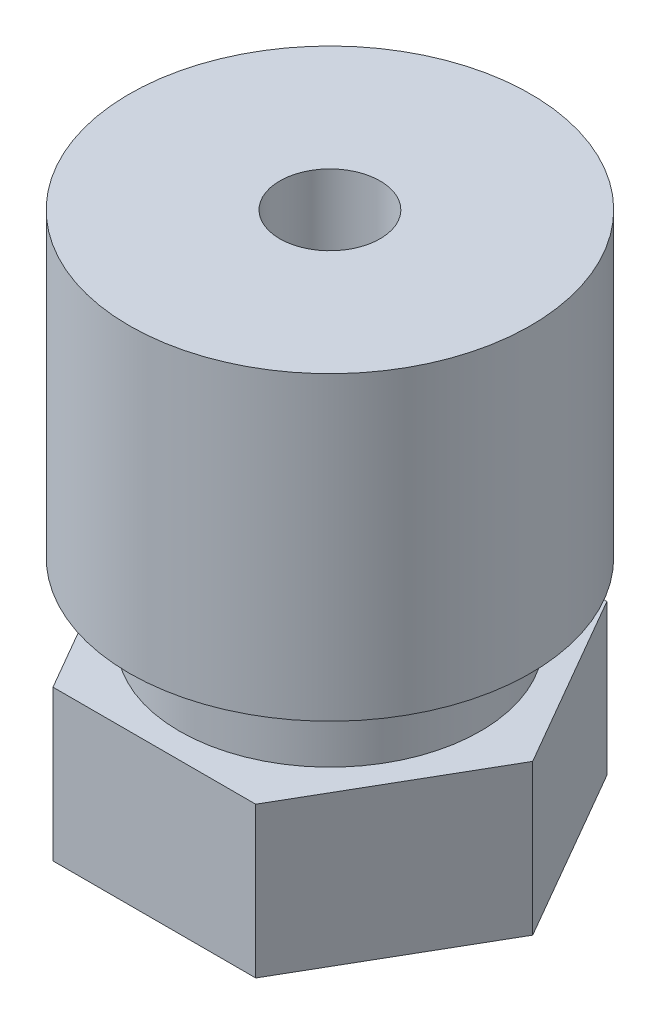
ISO-10303-21;
HEADER;
FILE_DESCRIPTION(('STEP AP214'),'2;1');
FILE_NAME('part.step','',(''),(''),'','','');
FILE_SCHEMA(('AUTOMOTIVE_DESIGN { 1 0 10303 214 1 1 1 1 }'));
ENDSEC;
DATA;
#1=APPLICATION_CONTEXT('core data for automotive mechanical design processes');
#2=APPLICATION_PROTOCOL_DEFINITION('international standard','automotive_design',2000,#1);
#3=PRODUCT_CONTEXT('',#1,'mechanical');
#4=PRODUCT('Part','Part','',(#3));
#5=PRODUCT_RELATED_PRODUCT_CATEGORY('part','',(#4));
#6=PRODUCT_DEFINITION_FORMATION('','',#4);
#7=PRODUCT_DEFINITION_CONTEXT('part definition',#1,'design');
#8=PRODUCT_DEFINITION('design','',#6,#7);
#9=PRODUCT_DEFINITION_SHAPE('','',#8);
#10=(LENGTH_UNIT() NAMED_UNIT(*) SI_UNIT(.MILLI.,.METRE.));
#11=(NAMED_UNIT(*) PLANE_ANGLE_UNIT() SI_UNIT($,.RADIAN.));
#12=(NAMED_UNIT(*) SI_UNIT($,.STERADIAN.) SOLID_ANGLE_UNIT());
#13=UNCERTAINTY_MEASURE_WITH_UNIT(LENGTH_MEASURE(1.E-05),#10,'distance_accuracy_value','');
#14=(GEOMETRIC_REPRESENTATION_CONTEXT(3) GLOBAL_UNCERTAINTY_ASSIGNED_CONTEXT((#13)) GLOBAL_UNIT_ASSIGNED_CONTEXT((#10,
#11,#12)) REPRESENTATION_CONTEXT('',''));
#15=CARTESIAN_POINT('',(0.,0.,0.));
#16=DIRECTION('',(0.,0.,1.));
#17=DIRECTION('',(1.,0.,0.));
#18=AXIS2_PLACEMENT_3D('',#15,#16,#17);
#19=CARTESIAN_POINT('',(0.,-10.5,0.));
#20=DIRECTION('',(0.,-1.,0.));
#21=DIRECTION('',(0.,0.,-1.));
#22=AXIS2_PLACEMENT_3D('',#19,#20,#21);
#23=PLANE('',#22);
#24=DIRECTION('',(-0.5,0.,0.866025403784438));
#25=VECTOR('',#24,1.);
#26=CARTESIAN_POINT('',(4.04145188432738,-10.5,0.));
#27=LINE('',#26,#25);
#28=CARTESIAN_POINT('',(4.04145188432738,-10.5,0.));
#29=VERTEX_POINT('',#28);
#30=CARTESIAN_POINT('',(2.02072594216369,-10.5,3.5));
#31=VERTEX_POINT('',#30);
#32=EDGE_CURVE('E154',#29,#31,#27,.T.);
#33=ORIENTED_EDGE('',*,*,#32,.T.);
#34=DIRECTION('',(-1.,0.,0.));
#35=VECTOR('',#34,1.);
#36=CARTESIAN_POINT('',(2.02072594216369,-10.5,3.5));
#37=LINE('',#36,#35);
#38=CARTESIAN_POINT('',(-2.02072594216369,-10.5,3.5));
#39=VERTEX_POINT('',#38);
#40=EDGE_CURVE('E112',#31,#39,#37,.T.);
#41=ORIENTED_EDGE('',*,*,#40,.T.);
#42=DIRECTION('',(-0.5,0.,-0.866025403784438));
#43=VECTOR('',#42,1.);
#44=CARTESIAN_POINT('',(-2.02072594216369,-10.5,3.5));
#45=LINE('',#44,#43);
#46=CARTESIAN_POINT('',(-4.04145188432738,-10.5,0.));
#47=VERTEX_POINT('',#46);
#48=EDGE_CURVE('E125',#39,#47,#45,.T.);
#49=ORIENTED_EDGE('',*,*,#48,.T.);
#50=DIRECTION('',(0.5,0.,-0.866025403784439));
#51=VECTOR('',#50,1.);
#52=CARTESIAN_POINT('',(-4.04145188432738,-10.5,0.));
#53=LINE('',#52,#51);
#54=CARTESIAN_POINT('',(-2.02072594216369,-10.5,-3.5));
#55=VERTEX_POINT('',#54);
#56=EDGE_CURVE('E119',#47,#55,#53,.T.);
#57=ORIENTED_EDGE('',*,*,#56,.T.);
#58=DIRECTION('',(1.,0.,0.));
#59=VECTOR('',#58,1.);
#60=CARTESIAN_POINT('',(-2.02072594216369,-10.5,-3.5));
#61=LINE('',#60,#59);
#62=CARTESIAN_POINT('',(2.02072594216369,-10.5,-3.5));
#63=VERTEX_POINT('',#62);
#64=EDGE_CURVE('E123',#55,#63,#61,.T.);
#65=ORIENTED_EDGE('',*,*,#64,.T.);
#66=DIRECTION('',(0.5,0.,0.866025403784439));
#67=VECTOR('',#66,1.);
#68=CARTESIAN_POINT('',(2.02072594216369,-10.5,-3.5));
#69=LINE('',#68,#67);
#70=EDGE_CURVE('E74',#63,#29,#69,.T.);
#71=ORIENTED_EDGE('',*,*,#70,.T.);
#72=EDGE_LOOP('',(#33,#41,#49,#57,#65,#71));
#73=FACE_BOUND('',#72,.T.);
#74=CARTESIAN_POINT('',(-1.3,-10.5,0.));
#75=CARTESIAN_POINT('',(-1.29999509406995,-10.5,0.0731397524246098));
#76=CARTESIAN_POINT('',(-1.29391307958444,-10.5,0.146336191440084));
#77=CARTESIAN_POINT('',(-1.26944646988295,-10.5,0.290695747893751));
#78=CARTESIAN_POINT('',(-1.25105088411953,-10.5,0.361856989586818));
#79=CARTESIAN_POINT('',(-1.20254190811046,-10.5,0.499781339993799));
#80=CARTESIAN_POINT('',(-1.17247078017679,-10.5,0.566559307195024));
#81=CARTESIAN_POINT('',(-1.10148829365781,-10.5,0.694231427496771));
#82=CARTESIAN_POINT('',(-1.06055744114646,-10.5,0.755114728318799));
#83=CARTESIAN_POINT('',(-0.969149725141846,-10.5,0.869152233797196));
#84=CARTESIAN_POINT('',(-0.918680329005375,-10.5,0.922312427379102));
#85=CARTESIAN_POINT('',(-0.809688032963714,-10.5,1.0194042467118));
#86=CARTESIAN_POINT('',(-0.75117918499286,-10.5,1.06335164395972));
#87=CARTESIAN_POINT('',(-0.627092226001133,-10.5,1.14118234943956));
#88=CARTESIAN_POINT('',(-0.561457113800964,-10.5,1.17497490410761));
#89=CARTESIAN_POINT('',(-0.425392311588158,-10.5,1.23090707015939));
#90=CARTESIAN_POINT('',(-0.35496285884348,-10.5,1.25304725773636));
#91=CARTESIAN_POINT('',(-0.212215785986424,-10.5,1.28479664502826));
#92=CARTESIAN_POINT('',(-0.139930054828874,-10.5,1.29454995701898));
#93=CARTESIAN_POINT('',(0.00526453391164971,-10.5,1.30201559149028));
#94=CARTESIAN_POINT('',(0.0781734857453288,-10.5,1.29972605935573));
#95=CARTESIAN_POINT('',(0.223398346360083,-10.5,1.28293815508924));
#96=CARTESIAN_POINT('',(0.295699011162656,-10.5,1.26830632520204));
#97=CARTESIAN_POINT('',(0.436728978477713,-10.5,1.22692848422932));
#98=CARTESIAN_POINT('',(0.50545915323875,-10.5,1.20018544749729));
#99=CARTESIAN_POINT('',(0.63656962239635,-10.5,1.13585288751893));
#100=CARTESIAN_POINT('',(0.699018133043136,-10.5,1.09840208592718));
#101=CARTESIAN_POINT('',(0.816936736257393,-10.5,1.01358452696966));
#102=CARTESIAN_POINT('',(0.872394274877255,-10.5,0.966200326855391));
#103=CARTESIAN_POINT('',(0.975191059668545,-10.5,0.862400092390814));
#104=CARTESIAN_POINT('',(1.02244663909678,-10.5,0.805901171285032));
#105=CARTESIAN_POINT('',(1.10672892776498,-10.5,0.685870705965187));
#106=CARTESIAN_POINT('',(1.14377345084548,-10.5,0.622351683571382));
#107=CARTESIAN_POINT('',(1.20662278341905,-10.5,0.489910190228619));
#108=CARTESIAN_POINT('',(1.23241746821195,-10.5,0.420982917472927));
#109=CARTESIAN_POINT('',(1.27191490110581,-10.5,0.279692306622596));
#110=CARTESIAN_POINT('',(1.2856148211848,-10.5,0.207328169079395));
#111=CARTESIAN_POINT('',(1.29684310102101,-10.5,0.098269025661967));
#112=CARTESIAN_POINT('',(1.29904303738562,-10.5,0.0619959922484413));
#113=CARTESIAN_POINT('',(1.30045818580457,-10.5,-0.0106073459709525));
#114=CARTESIAN_POINT('',(1.29967351821381,-10.5,-0.0469376484083782));
#115=CARTESIAN_POINT('',(1.29278506078076,-10.5,-0.155618651409656));
#116=CARTESIAN_POINT('',(1.28215440977102,-10.5,-0.227733465513735));
#117=CARTESIAN_POINT('',(1.24868906542712,-10.5,-0.369983578334539));
#118=CARTESIAN_POINT('',(1.22571185638803,-10.5,-0.440085481131818));
#119=CARTESIAN_POINT('',(1.18261681867987,-10.5,-0.541475115102984));
#120=CARTESIAN_POINT('',(1.16680854122418,-10.5,-0.574652324986531));
#121=CARTESIAN_POINT('',(1.13242186675416,-10.5,-0.639578970101635));
#122=CARTESIAN_POINT('',(1.11384089513845,-10.5,-0.671327042251284));
#123=CARTESIAN_POINT('',(1.05461338713606,-10.5,-0.763339445345701));
#124=CARTESIAN_POINT('',(1.0101321239821,-10.5,-0.821189715033016));
#125=CARTESIAN_POINT('',(0.912188290770348,-10.5,-0.928709101763266));
#126=CARTESIAN_POINT('',(0.858725453379276,-10.5,-0.978377975202746));
#127=CARTESIAN_POINT('',(0.77260865721458,-10.5,-1.04595918524156));
#128=CARTESIAN_POINT('',(0.742703569807401,-10.5,-1.06744820376739));
#129=CARTESIAN_POINT('',(0.681214973040406,-10.5,-1.1078026717983));
#130=CARTESIAN_POINT('',(0.649633093766746,-10.5,-1.12667060709275));
#131=CARTESIAN_POINT('',(0.552644271470279,-10.5,-1.17914219549181));
#132=CARTESIAN_POINT('',(0.484953872244063,-10.5,-1.20864521337926));
#133=CARTESIAN_POINT('',(0.346101740355802,-10.5,-1.25548531427466));
#134=CARTESIAN_POINT('',(0.274970506899517,-10.5,-1.27291369354865));
#135=CARTESIAN_POINT('',(0.130769436580619,-10.5,-1.29555451623943));
#136=CARTESIAN_POINT('',(0.0576989431141625,-10.5,-1.30076276733665));
#137=CARTESIAN_POINT('',(-0.088390329226983,-10.5,-1.29905942319262));
#138=CARTESIAN_POINT('',(-0.161408933293115,-10.5,-1.29213287855449));
#139=CARTESIAN_POINT('',(-0.305211369217307,-10.5,-1.26603312939423));
#140=CARTESIAN_POINT('',(-0.375996001095705,-10.5,-1.24686436244789));
#141=CARTESIAN_POINT('',(-0.513196770393043,-10.5,-1.1968644714497));
#142=CARTESIAN_POINT('',(-0.579619043671551,-10.5,-1.166050158451));
#143=CARTESIAN_POINT('',(-0.706367230088701,-10.5,-1.09371448518124));
#144=CARTESIAN_POINT('',(-0.766691657243576,-10.5,-1.05219052379011));
#145=CARTESIAN_POINT('',(-0.879609301338283,-10.5,-0.959658712305258));
#146=CARTESIAN_POINT('',(-0.932198817359808,-10.5,-0.908646348565437));
#147=CARTESIAN_POINT('',(-1.02816182261668,-10.5,-0.798566611328347));
#148=CARTESIAN_POINT('',(-1.07153375273803,-10.5,-0.739497877901333));
#149=CARTESIAN_POINT('',(-1.14806617196759,-10.5,-0.614445303358811));
#150=CARTESIAN_POINT('',(-1.18114485742293,-10.5,-0.548411384925483));
#151=CARTESIAN_POINT('',(-1.23554077934922,-10.5,-0.411733479069517));
#152=CARTESIAN_POINT('',(-1.25687360950157,-10.5,-0.341095743727287));
#153=CARTESIAN_POINT('',(-1.2813708776361,-10.5,-0.224986536072151));
#154=CARTESIAN_POINT('',(-1.28836754575148,-10.5,-0.180287277951681));
#155=CARTESIAN_POINT('',(-1.29768403333828,-10.5,-0.0903992894059815));
#156=CARTESIAN_POINT('',(-1.30000303254275,-10.5,-0.045210474529579));
#157=CARTESIAN_POINT('',(-1.3,-10.5,0.));
#158=B_SPLINE_CURVE_WITH_KNOTS('',3,(#74,#75,#76,#77,#78,#79,#80,#81,#82,#83,#84,#85,#86,#87,
#88,#89,#90,#91,#92,#93,#94,#95,#96,#97,#98,#99,#100,#101,#102,#103,#104,#105,#106,#107,#108,
#109,#110,#111,#112,#113,#114,#115,#116,#117,#118,#119,#120,#121,#122,#123,#124,#125,#126,#127,
#128,#129,#130,#131,#132,#133,#134,#135,#136,#137,#138,#139,#140,#141,#142,#143,#144,#145,#146,
#147,#148,#149,#150,#151,#152,#153,#154,#155,#156,#157),.UNSPECIFIED.,.T.,.F.,(4,2,2,2,2,2,2,2,
2,2,2,2,2,2,2,2,2,2,2,2,2,2,2,2,2,2,2,2,2,2,2,2,2,2,2,2,2,2,2,2,2,4),(0.,0.219250017616236,
0.438695989474797,0.657354922353311,0.876409049736202,1.09529239317909,1.31379791112528,
1.53420179592832,1.75459478104365,1.97239943492166,2.19023763200842,2.41046197214736,
2.63063225738224,2.84807026547842,3.06589333524029,3.28582221091652,3.5053649426558,
3.72510485414781,3.94489613206565,4.05380911959212,4.16271771522119,4.3803144548819,
4.60047862157793,4.71061610556909,4.82085650218359,5.03870298595462,5.25655595499609,
5.3669148918279,5.47716844102544,5.69752397572226,5.91619466610907,6.13494036417532,
6.35395573436898,6.57289176062594,6.79151293920884,7.01018726578523,7.22896588332373,
7.44778147689995,7.66829409675779,7.88851325599585,8.0240163066008,8.1595431166931),.UNSPECIFIED.);
#159=CARTESIAN_POINT('',(1.3,-10.5,0.));
#160=VERTEX_POINT('',#159);
#161=EDGE_CURVE('E173',#160,#160,#158,.F.);
#162=ORIENTED_EDGE('',*,*,#161,.F.);
#163=EDGE_LOOP('',(#162));
#164=FACE_BOUND('',#163,.T.);
#165=ADVANCED_FACE('F55',(#73,#164),#23,.T.);
#166=CARTESIAN_POINT('',(4.,0.,0.));
#167=DIRECTION('',(0.,-1.,0.));
#168=DIRECTION('',(0.,0.,-1.));
#169=AXIS2_PLACEMENT_3D('',#166,#167,#168);
#170=PLANE('',#169);
#171=CARTESIAN_POINT('',(0.,0.,0.));
#172=DIRECTION('',(0.,1.,0.));
#173=DIRECTION('',(0.,0.,1.));
#174=AXIS2_PLACEMENT_3D('',#171,#172,#173);
#175=CIRCLE('',#174,1.);
#176=CARTESIAN_POINT('',(0.,0.,1.));
#177=VERTEX_POINT('',#176);
#178=EDGE_CURVE('E13',#177,#177,#175,.T.);
#179=ORIENTED_EDGE('',*,*,#178,.F.);
#180=EDGE_LOOP('',(#179));
#181=FACE_BOUND('',#180,.T.);
#182=CARTESIAN_POINT('',(0.,0.,0.));
#183=DIRECTION('',(0.,1.,0.));
#184=DIRECTION('',(0.,0.,1.));
#185=AXIS2_PLACEMENT_3D('',#182,#183,#184);
#186=CIRCLE('',#185,4.);
#187=CARTESIAN_POINT('',(0.,0.,4.));
#188=VERTEX_POINT('',#187);
#189=EDGE_CURVE('E164',#188,#188,#186,.T.);
#190=ORIENTED_EDGE('',*,*,#189,.T.);
#191=EDGE_LOOP('',(#190));
#192=FACE_BOUND('',#191,.T.);
#193=ADVANCED_FACE('F57',(#181,#192),#170,.F.);
#194=CARTESIAN_POINT('',(0.,0.,0.));
#195=DIRECTION('',(0.,1.,0.));
#196=DIRECTION('',(0.,0.,1.));
#197=AXIS2_PLACEMENT_3D('',#194,#195,#196);
#198=CYLINDRICAL_SURFACE('',#197,1.);
#199=ORIENTED_EDGE('',*,*,#178,.T.);
#200=EDGE_LOOP('',(#199));
#201=FACE_BOUND('',#200,.T.);
#202=CARTESIAN_POINT('',(0.,-10.5,0.));
#203=DIRECTION('',(0.,-1.,0.));
#204=DIRECTION('',(0.,0.,-1.));
#205=AXIS2_PLACEMENT_3D('',#202,#203,#204);
#206=CIRCLE('',#205,1.);
#207=CARTESIAN_POINT('',(0.,-10.5,-1.));
#208=VERTEX_POINT('',#207);
#209=EDGE_CURVE('E147',#208,#208,#206,.T.);
#210=ORIENTED_EDGE('',*,*,#209,.T.);
#211=EDGE_LOOP('',(#210));
#212=FACE_BOUND('',#211,.T.);
#213=ADVANCED_FACE('F222',(#201,#212),#198,.F.);
#214=CARTESIAN_POINT('',(0.,0.,0.));
#215=DIRECTION('',(0.,1.,0.));
#216=DIRECTION('',(0.,0.,1.));
#217=AXIS2_PLACEMENT_3D('',#214,#215,#216);
#218=CYLINDRICAL_SURFACE('',#217,3.);
#219=CARTESIAN_POINT('',(0.,-6.,0.));
#220=DIRECTION('',(0.,1.,0.));
#221=DIRECTION('',(0.,0.,1.));
#222=AXIS2_PLACEMENT_3D('',#219,#220,#221);
#223=CIRCLE('',#222,3.);
#224=CARTESIAN_POINT('',(0.,-6.,3.));
#225=VERTEX_POINT('',#224);
#226=EDGE_CURVE('E65',#225,#225,#223,.T.);
#227=ORIENTED_EDGE('',*,*,#226,.F.);
#228=EDGE_LOOP('',(#227));
#229=FACE_BOUND('',#228,.T.);
#230=CARTESIAN_POINT('',(0.,-7.5,0.));
#231=DIRECTION('',(0.,1.,0.));
#232=DIRECTION('',(0.,0.,1.));
#233=AXIS2_PLACEMENT_3D('',#230,#231,#232);
#234=CIRCLE('',#233,3.);
#235=CARTESIAN_POINT('',(0.,-7.5,3.));
#236=VERTEX_POINT('',#235);
#237=EDGE_CURVE('E163',#236,#236,#234,.T.);
#238=ORIENTED_EDGE('',*,*,#237,.T.);
#239=EDGE_LOOP('',(#238));
#240=FACE_BOUND('',#239,.T.);
#241=ADVANCED_FACE('F219',(#229,#240),#218,.T.);
#242=CARTESIAN_POINT('',(3.,-6.,0.));
#243=DIRECTION('',(0.,1.,0.));
#244=DIRECTION('',(0.,0.,1.));
#245=AXIS2_PLACEMENT_3D('',#242,#243,#244);
#246=PLANE('',#245);
#247=CARTESIAN_POINT('',(0.,-6.,0.));
#248=DIRECTION('',(0.,1.,0.));
#249=DIRECTION('',(0.,0.,1.));
#250=AXIS2_PLACEMENT_3D('',#247,#248,#249);
#251=CIRCLE('',#250,4.);
#252=CARTESIAN_POINT('',(0.,-6.,4.));
#253=VERTEX_POINT('',#252);
#254=EDGE_CURVE('E167',#253,#253,#251,.T.);
#255=ORIENTED_EDGE('',*,*,#254,.F.);
#256=EDGE_LOOP('',(#255));
#257=FACE_BOUND('',#256,.T.);
#258=ORIENTED_EDGE('',*,*,#226,.T.);
#259=EDGE_LOOP('',(#258));
#260=FACE_BOUND('',#259,.T.);
#261=ADVANCED_FACE('F215',(#257,#260),#246,.F.);
#262=CARTESIAN_POINT('',(0.,0.,0.));
#263=DIRECTION('',(0.,1.,0.));
#264=DIRECTION('',(0.,0.,1.));
#265=AXIS2_PLACEMENT_3D('',#262,#263,#264);
#266=CYLINDRICAL_SURFACE('',#265,4.);
#267=ORIENTED_EDGE('',*,*,#189,.F.);
#268=EDGE_LOOP('',(#267));
#269=FACE_BOUND('',#268,.T.);
#270=ORIENTED_EDGE('',*,*,#254,.T.);
#271=EDGE_LOOP('',(#270));
#272=FACE_BOUND('',#271,.T.);
#273=ADVANCED_FACE('F194',(#269,#272),#266,.T.);
#274=CARTESIAN_POINT('',(0.,-7.5,0.));
#275=DIRECTION('',(0.,-1.,0.));
#276=DIRECTION('',(0.,0.,-1.));
#277=AXIS2_PLACEMENT_3D('',#274,#275,#276);
#278=PLANE('',#277);
#279=ORIENTED_EDGE('',*,*,#237,.F.);
#280=EDGE_LOOP('',(#279));
#281=FACE_BOUND('',#280,.T.);
#282=DIRECTION('',(-0.5,0.,0.866025403784438));
#283=VECTOR('',#282,1.);
#284=CARTESIAN_POINT('',(4.04145188432738,-7.5,0.));
#285=LINE('',#284,#283);
#286=CARTESIAN_POINT('',(4.04145188432738,-7.5,0.));
#287=VERTEX_POINT('',#286);
#288=CARTESIAN_POINT('',(2.02072594216369,-7.5,3.5));
#289=VERTEX_POINT('',#288);
#290=EDGE_CURVE('E143',#287,#289,#285,.T.);
#291=ORIENTED_EDGE('',*,*,#290,.F.);
#292=DIRECTION('',(0.5,0.,0.866025403784439));
#293=VECTOR('',#292,1.);
#294=CARTESIAN_POINT('',(2.02072594216369,-7.5,-3.5));
#295=LINE('',#294,#293);
#296=CARTESIAN_POINT('',(2.02072594216369,-7.5,-3.5));
#297=VERTEX_POINT('',#296);
#298=EDGE_CURVE('E103',#297,#287,#295,.T.);
#299=ORIENTED_EDGE('',*,*,#298,.F.);
#300=DIRECTION('',(1.,0.,0.));
#301=VECTOR('',#300,1.);
#302=CARTESIAN_POINT('',(-2.02072594216369,-7.5,-3.5));
#303=LINE('',#302,#301);
#304=CARTESIAN_POINT('',(-2.02072594216369,-7.5,-3.5));
#305=VERTEX_POINT('',#304);
#306=EDGE_CURVE('E97',#305,#297,#303,.T.);
#307=ORIENTED_EDGE('',*,*,#306,.F.);
#308=DIRECTION('',(0.5,0.,-0.866025403784439));
#309=VECTOR('',#308,1.);
#310=CARTESIAN_POINT('',(-4.04145188432738,-7.5,0.));
#311=LINE('',#310,#309);
#312=CARTESIAN_POINT('',(-4.04145188432738,-7.5,0.));
#313=VERTEX_POINT('',#312);
#314=EDGE_CURVE('E133',#313,#305,#311,.T.);
#315=ORIENTED_EDGE('',*,*,#314,.F.);
#316=DIRECTION('',(-0.5,0.,-0.866025403784438));
#317=VECTOR('',#316,1.);
#318=CARTESIAN_POINT('',(-2.02072594216369,-7.5,3.5));
#319=LINE('',#318,#317);
#320=CARTESIAN_POINT('',(-2.02072594216369,-7.5,3.5));
#321=VERTEX_POINT('',#320);
#322=EDGE_CURVE('E149',#321,#313,#319,.T.);
#323=ORIENTED_EDGE('',*,*,#322,.F.);
#324=DIRECTION('',(-1.,0.,0.));
#325=VECTOR('',#324,1.);
#326=CARTESIAN_POINT('',(2.02072594216369,-7.5,3.5));
#327=LINE('',#326,#325);
#328=EDGE_CURVE('E146',#289,#321,#327,.T.);
#329=ORIENTED_EDGE('',*,*,#328,.F.);
#330=EDGE_LOOP('',(#291,#299,#307,#315,#323,#329));
#331=FACE_BOUND('',#330,.T.);
#332=ADVANCED_FACE('F190',(#281,#331),#278,.F.);
#333=CARTESIAN_POINT('',(4.04145188432738,-10.5,0.));
#334=DIRECTION('',(-0.866025403784438,0.,-0.5));
#335=DIRECTION('',(-0.5,0.,0.866025403784438));
#336=AXIS2_PLACEMENT_3D('',#333,#334,#335);
#337=PLANE('',#336);
#338=ORIENTED_EDGE('',*,*,#290,.T.);
#339=DIRECTION('',(0.,1.,0.));
#340=VECTOR('',#339,1.);
#341=CARTESIAN_POINT('',(2.02072594216369,-10.5,3.5));
#342=LINE('',#341,#340);
#343=EDGE_CURVE('E161',#31,#289,#342,.T.);
#344=ORIENTED_EDGE('',*,*,#343,.F.);
#345=ORIENTED_EDGE('',*,*,#32,.F.);
#346=DIRECTION('',(0.,1.,0.));
#347=VECTOR('',#346,1.);
#348=CARTESIAN_POINT('',(4.04145188432738,-10.5,0.));
#349=LINE('',#348,#347);
#350=EDGE_CURVE('E139',#29,#287,#349,.T.);
#351=ORIENTED_EDGE('',*,*,#350,.T.);
#352=EDGE_LOOP('',(#338,#344,#345,#351));
#353=FACE_BOUND('',#352,.T.);
#354=ADVANCED_FACE('F193',(#353),#337,.F.);
#355=CARTESIAN_POINT('',(2.02072594216369,-10.5,3.5));
#356=DIRECTION('',(0.,0.,-1.));
#357=DIRECTION('',(-1.,0.,0.));
#358=AXIS2_PLACEMENT_3D('',#355,#356,#357);
#359=PLANE('',#358);
#360=ORIENTED_EDGE('',*,*,#328,.T.);
#361=DIRECTION('',(0.,1.,0.));
#362=VECTOR('',#361,1.);
#363=CARTESIAN_POINT('',(-2.02072594216369,-10.5,3.5));
#364=LINE('',#363,#362);
#365=EDGE_CURVE('E158',#39,#321,#364,.T.);
#366=ORIENTED_EDGE('',*,*,#365,.F.);
#367=ORIENTED_EDGE('',*,*,#40,.F.);
#368=ORIENTED_EDGE('',*,*,#343,.T.);
#369=EDGE_LOOP('',(#360,#366,#367,#368));
#370=FACE_BOUND('',#369,.T.);
#371=ADVANCED_FACE('F206',(#370),#359,.F.);
#372=CARTESIAN_POINT('',(-2.02072594216369,-10.5,3.5));
#373=DIRECTION('',(0.866025403784439,0.,-0.5));
#374=DIRECTION('',(-0.5,0.,-0.866025403784439));
#375=AXIS2_PLACEMENT_3D('',#372,#373,#374);
#376=PLANE('',#375);
#377=ORIENTED_EDGE('',*,*,#322,.T.);
#378=DIRECTION('',(0.,1.,0.));
#379=VECTOR('',#378,1.);
#380=CARTESIAN_POINT('',(-4.04145188432738,-10.5,0.));
#381=LINE('',#380,#379);
#382=EDGE_CURVE('E134',#47,#313,#381,.T.);
#383=ORIENTED_EDGE('',*,*,#382,.F.);
#384=ORIENTED_EDGE('',*,*,#48,.F.);
#385=ORIENTED_EDGE('',*,*,#365,.T.);
#386=EDGE_LOOP('',(#377,#383,#384,#385));
#387=FACE_BOUND('',#386,.T.);
#388=ADVANCED_FACE('F203',(#387),#376,.F.);
#389=CARTESIAN_POINT('',(-4.04145188432738,-10.5,0.));
#390=DIRECTION('',(0.866025403784439,0.,0.5));
#391=DIRECTION('',(0.5,0.,-0.866025403784439));
#392=AXIS2_PLACEMENT_3D('',#389,#390,#391);
#393=PLANE('',#392);
#394=ORIENTED_EDGE('',*,*,#314,.T.);
#395=DIRECTION('',(0.,1.,0.));
#396=VECTOR('',#395,1.);
#397=CARTESIAN_POINT('',(-2.02072594216369,-10.5,-3.5));
#398=LINE('',#397,#396);
#399=EDGE_CURVE('E130',#55,#305,#398,.T.);
#400=ORIENTED_EDGE('',*,*,#399,.F.);
#401=ORIENTED_EDGE('',*,*,#56,.F.);
#402=ORIENTED_EDGE('',*,*,#382,.T.);
#403=EDGE_LOOP('',(#394,#400,#401,#402));
#404=FACE_BOUND('',#403,.T.);
#405=ADVANCED_FACE('F131',(#404),#393,.F.);
#406=CARTESIAN_POINT('',(-2.02072594216369,-10.5,-3.5));
#407=DIRECTION('',(0.,0.,1.));
#408=DIRECTION('',(1.,0.,0.));
#409=AXIS2_PLACEMENT_3D('',#406,#407,#408);
#410=PLANE('',#409);
#411=ORIENTED_EDGE('',*,*,#306,.T.);
#412=DIRECTION('',(0.,1.,0.));
#413=VECTOR('',#412,1.);
#414=CARTESIAN_POINT('',(2.02072594216369,-10.5,-3.5));
#415=LINE('',#414,#413);
#416=EDGE_CURVE('E135',#63,#297,#415,.T.);
#417=ORIENTED_EDGE('',*,*,#416,.F.);
#418=ORIENTED_EDGE('',*,*,#64,.F.);
#419=ORIENTED_EDGE('',*,*,#399,.T.);
#420=EDGE_LOOP('',(#411,#417,#418,#419));
#421=FACE_BOUND('',#420,.T.);
#422=ADVANCED_FACE('F137',(#421),#410,.F.);
#423=CARTESIAN_POINT('',(2.02072594216369,-10.5,-3.5));
#424=DIRECTION('',(-0.866025403784439,0.,0.5));
#425=DIRECTION('',(0.5,0.,0.866025403784439));
#426=AXIS2_PLACEMENT_3D('',#423,#424,#425);
#427=PLANE('',#426);
#428=ORIENTED_EDGE('',*,*,#298,.T.);
#429=ORIENTED_EDGE('',*,*,#350,.F.);
#430=ORIENTED_EDGE('',*,*,#70,.F.);
#431=ORIENTED_EDGE('',*,*,#416,.T.);
#432=EDGE_LOOP('',(#428,#429,#430,#431));
#433=FACE_BOUND('',#432,.T.);
#434=ADVANCED_FACE('F196',(#433),#427,.F.);
#435=CARTESIAN_POINT('',(0.625,-12.5,0.));
#436=CARTESIAN_POINT('',(0.85,-11.8333333333333,0.));
#437=CARTESIAN_POINT('',(1.075,-11.1666666666667,0.));
#438=CARTESIAN_POINT('',(1.3,-10.5,0.));
#439=CARTESIAN_POINT('',(0.625,-12.5,-0.0172473440600969));
#440=CARTESIAN_POINT('',(0.85,-11.8333333333333,-0.0234563879217318));
#441=CARTESIAN_POINT('',(1.075,-11.1666666666667,-0.0296654317833667));
#442=CARTESIAN_POINT('',(1.3,-10.5,-0.0358744756450016));
#443=CARTESIAN_POINT('',(0.62359973440601,-12.5,-0.0514175633682712));
#444=CARTESIAN_POINT('',(0.848095638792173,-11.8333333333333,-0.0699278861808488));
#445=CARTESIAN_POINT('',(1.07259154317834,-11.1666666666667,-0.0884382089934264));
#446=CARTESIAN_POINT('',(1.2970874475645,-10.5,-0.106948531806004));
#447=CARTESIAN_POINT('',(0.617459908750349,-12.5,-0.101538116377179));
#448=CARTESIAN_POINT('',(0.839745475900475,-11.8333333333333,-0.138091838272964));
#449=CARTESIAN_POINT('',(1.0620310430506,-11.1666666666667,-0.174645560168748));
#450=CARTESIAN_POINT('',(1.28431661020073,-10.5,-0.211199282064533));
#451=CARTESIAN_POINT('',(0.607442025347308,-12.5,-0.150362523915438));
#452=CARTESIAN_POINT('',(0.826121154472339,-11.8333333333333,-0.204493032524995));
#453=CARTESIAN_POINT('',(1.04480028359737,-11.1666666666667,-0.258623541134553));
#454=CARTESIAN_POINT('',(1.2634794127224,-10.5,-0.31275404974411));
#455=CARTESIAN_POINT('',(0.525034595548562,-12.5,-0.434563879217318));
#456=CARTESIAN_POINT('',(0.714047049946044,-11.8333333333333,-0.591006875735552));
#457=CARTESIAN_POINT('',(0.903059504343526,-11.1666666666667,-0.747449872253787));
#458=CARTESIAN_POINT('',(1.09207195874101,-10.5,-0.903892868772021));
#459=CARTESIAN_POINT('',(0.27595750496155,-12.5,-0.625));
#460=CARTESIAN_POINT('',(0.375302206747708,-11.8333333333333,-0.85));
#461=CARTESIAN_POINT('',(0.474646908533866,-11.1666666666667,-1.075));
#462=CARTESIAN_POINT('',(0.573991610320024,-10.5,-1.3));
#463=CARTESIAN_POINT('',(-0.344946881201938,-12.5,-0.625));
#464=CARTESIAN_POINT('',(-0.469127758434635,-11.8333333333333,-0.85));
#465=CARTESIAN_POINT('',(-0.593308635667333,-11.1666666666667,-1.075));
#466=CARTESIAN_POINT('',(-0.71748951290003,-10.5,-1.3));
#467=CARTESIAN_POINT('',(-0.625,-12.5,-0.344946881201937));
#468=CARTESIAN_POINT('',(-0.85,-11.8333333333333,-0.469127758434635));
#469=CARTESIAN_POINT('',(-1.075,-11.1666666666667,-0.593308635667332));
#470=CARTESIAN_POINT('',(-1.3,-10.5,-0.71748951290003));
#471=CARTESIAN_POINT('',(-0.625,-12.5,0.344946881201938));
#472=CARTESIAN_POINT('',(-0.85,-11.8333333333333,0.469127758434635));
#473=CARTESIAN_POINT('',(-1.075,-11.1666666666667,0.593308635667332));
#474=CARTESIAN_POINT('',(-1.3,-10.5,0.71748951290003));
#475=CARTESIAN_POINT('',(-0.344946881201937,-12.5,0.625));
#476=CARTESIAN_POINT('',(-0.469127758434635,-11.8333333333333,0.85));
#477=CARTESIAN_POINT('',(-0.593308635667332,-11.1666666666667,1.075));
#478=CARTESIAN_POINT('',(-0.71748951290003,-10.5,1.3));
#479=CARTESIAN_POINT('',(0.27595750496155,-12.5,0.625));
#480=CARTESIAN_POINT('',(0.375302206747708,-11.8333333333333,0.85));
#481=CARTESIAN_POINT('',(0.474646908533866,-11.1666666666667,1.075));
#482=CARTESIAN_POINT('',(0.573991610320024,-10.5,1.3));
#483=CARTESIAN_POINT('',(0.525034595548562,-12.5,0.434563879217318));
#484=CARTESIAN_POINT('',(0.714047049946044,-11.8333333333333,0.591006875735552));
#485=CARTESIAN_POINT('',(0.903059504343526,-11.1666666666667,0.747449872253786));
#486=CARTESIAN_POINT('',(1.09207195874101,-10.5,0.90389286877202));
#487=CARTESIAN_POINT('',(0.607442025347308,-12.5,0.150362523915437));
#488=CARTESIAN_POINT('',(0.826121154472339,-11.8333333333333,0.204493032524995));
#489=CARTESIAN_POINT('',(1.04480028359737,-11.1666666666667,0.258623541134552));
#490=CARTESIAN_POINT('',(1.2634794127224,-10.5,0.31275404974411));
#491=CARTESIAN_POINT('',(0.617459908750349,-12.5,0.101538116377179));
#492=CARTESIAN_POINT('',(0.839745475900475,-11.8333333333333,0.138091838272963));
#493=CARTESIAN_POINT('',(1.0620310430506,-11.1666666666667,0.174645560168748));
#494=CARTESIAN_POINT('',(1.28431661020073,-10.5,0.211199282064532));
#495=CARTESIAN_POINT('',(0.62359973440601,-12.5,0.0514175633682711));
#496=CARTESIAN_POINT('',(0.848095638792173,-11.8333333333333,0.0699278861808487));
#497=CARTESIAN_POINT('',(1.07259154317834,-11.1666666666667,0.0884382089934263));
#498=CARTESIAN_POINT('',(1.2970874475645,-10.5,0.106948531806004));
#499=CARTESIAN_POINT('',(0.625,-12.5,0.0172473440600967));
#500=CARTESIAN_POINT('',(0.85,-11.8333333333333,0.0234563879217315));
#501=CARTESIAN_POINT('',(1.075,-11.1666666666667,0.0296654317833663));
#502=CARTESIAN_POINT('',(1.3,-10.5,0.0358744756450012));
#503=CARTESIAN_POINT('',(0.625,-12.5,0.));
#504=CARTESIAN_POINT('',(0.85,-11.8333333333333,0.));
#505=CARTESIAN_POINT('',(1.075,-11.1666666666667,0.));
#506=CARTESIAN_POINT('',(1.3,-10.5,0.));
#507=B_SPLINE_SURFACE_WITH_KNOTS('',3,3,((#435,#436,#437,#438),(#439,#440,#441,#442),(#443,#444,
#445,#446),(#447,#448,#449,#450),(#451,#452,#453,#454),(#455,#456,#457,#458),(#459,#460,#461,
#462),(#463,#464,#465,#466),(#467,#468,#469,#470),(#471,#472,#473,#474),(#475,#476,#477,#478),
(#479,#480,#481,#482),(#483,#484,#485,#486),(#487,#488,#489,#490),(#491,#492,#493,#494),(#495,
#496,#497,#498),(#499,#500,#501,#502),(#503,#504,#505,#506)),.UNSPECIFIED.,.T.,.F.,.F.,(4,1,1,1,
1,2,2,2,1,1,1,1,4),(4,4),(0.,0.0125,0.0249999999999999,0.0375000000000001,0.05,0.25,0.5,0.75,
0.95,0.9625,0.975,0.9875,1.),(0.,1.),.UNSPECIFIED.);
#508=CARTESIAN_POINT('',(0.,-12.5,0.));
#509=DIRECTION('',(0.,-1.,0.));
#510=DIRECTION('',(0.,0.,-1.));
#511=AXIS2_PLACEMENT_3D('',#508,#509,#510);
#512=CIRCLE('',#511,0.625);
#513=CARTESIAN_POINT('',(0.625,-12.5,0.));
#514=VERTEX_POINT('',#513);
#515=EDGE_CURVE('E179',#514,#514,#512,.T.);
#516=CARTESIAN_POINT('',(0.625,-12.5,0.));
#517=CARTESIAN_POINT('',(0.632031249999999,-12.4791666666667,0.));
#518=CARTESIAN_POINT('',(0.639062499999999,-12.4583333333333,0.));
#519=CARTESIAN_POINT('',(0.653125,-12.4166666666667,0.));
#520=CARTESIAN_POINT('',(0.66015625,-12.3958333333333,0.));
#521=CARTESIAN_POINT('',(0.67421875,-12.3541666666667,0.));
#522=CARTESIAN_POINT('',(0.68125,-12.3333333333333,0.));
#523=CARTESIAN_POINT('',(0.6953125,-12.2916666666667,0.));
#524=CARTESIAN_POINT('',(0.70234375,-12.2708333333333,0.));
#525=CARTESIAN_POINT('',(0.71640625,-12.2291666666667,0.));
#526=CARTESIAN_POINT('',(0.7234375,-12.2083333333333,0.));
#527=CARTESIAN_POINT('',(0.7375,-12.1666666666667,0.));
#528=CARTESIAN_POINT('',(0.74453125,-12.1458333333333,0.));
#529=CARTESIAN_POINT('',(0.75859375,-12.1041666666667,0.));
#530=CARTESIAN_POINT('',(0.765625,-12.0833333333333,0.));
#531=CARTESIAN_POINT('',(0.7796875,-12.0416666666667,0.));
#532=CARTESIAN_POINT('',(0.78671875,-12.0208333333333,0.));
#533=CARTESIAN_POINT('',(0.80078125,-11.9791666666667,0.));
#534=CARTESIAN_POINT('',(0.8078125,-11.9583333333333,0.));
#535=CARTESIAN_POINT('',(0.821875,-11.9166666666667,0.));
#536=CARTESIAN_POINT('',(0.82890625,-11.8958333333333,0.));
#537=CARTESIAN_POINT('',(0.84296875,-11.8541666666667,0.));
#538=CARTESIAN_POINT('',(0.85,-11.8333333333333,0.));
#539=CARTESIAN_POINT('',(0.8640625,-11.7916666666667,0.));
#540=CARTESIAN_POINT('',(0.87109375,-11.7708333333333,0.));
#541=CARTESIAN_POINT('',(0.88515625,-11.7291666666667,0.));
#542=CARTESIAN_POINT('',(0.8921875,-11.7083333333333,0.));
#543=CARTESIAN_POINT('',(0.90625,-11.6666666666667,0.));
#544=CARTESIAN_POINT('',(0.91328125,-11.6458333333333,0.));
#545=CARTESIAN_POINT('',(0.92734375,-11.6041666666667,0.));
#546=CARTESIAN_POINT('',(0.934375,-11.5833333333333,0.));
#547=CARTESIAN_POINT('',(0.9484375,-11.5416666666667,0.));
#548=CARTESIAN_POINT('',(0.95546875,-11.5208333333333,0.));
#549=CARTESIAN_POINT('',(0.96953125,-11.4791666666667,0.));
#550=CARTESIAN_POINT('',(0.9765625,-11.4583333333333,0.));
#551=CARTESIAN_POINT('',(0.990625,-11.4166666666667,0.));
#552=CARTESIAN_POINT('',(0.99765625,-11.3958333333333,0.));
#553=CARTESIAN_POINT('',(1.01171875,-11.3541666666667,0.));
#554=CARTESIAN_POINT('',(1.01875,-11.3333333333333,0.));
#555=CARTESIAN_POINT('',(1.0328125,-11.2916666666667,0.));
#556=CARTESIAN_POINT('',(1.03984375,-11.2708333333333,0.));
#557=CARTESIAN_POINT('',(1.05390625,-11.2291666666667,0.));
#558=CARTESIAN_POINT('',(1.0609375,-11.2083333333333,0.));
#559=CARTESIAN_POINT('',(1.075,-11.1666666666667,0.));
#560=CARTESIAN_POINT('',(1.08203125,-11.1458333333333,0.));
#561=CARTESIAN_POINT('',(1.09609375,-11.1041666666667,0.));
#562=CARTESIAN_POINT('',(1.103125,-11.0833333333333,0.));
#563=CARTESIAN_POINT('',(1.1171875,-11.0416666666667,0.));
#564=CARTESIAN_POINT('',(1.12421875,-11.0208333333333,0.));
#565=CARTESIAN_POINT('',(1.13828125,-10.9791666666667,0.));
#566=CARTESIAN_POINT('',(1.1453125,-10.9583333333333,0.));
#567=CARTESIAN_POINT('',(1.159375,-10.9166666666667,0.));
#568=CARTESIAN_POINT('',(1.16640625,-10.8958333333333,0.));
#569=CARTESIAN_POINT('',(1.18046875,-10.8541666666667,0.));
#570=CARTESIAN_POINT('',(1.1875,-10.8333333333333,0.));
#571=CARTESIAN_POINT('',(1.2015625,-10.7916666666667,0.));
#572=CARTESIAN_POINT('',(1.20859375,-10.7708333333333,0.));
#573=CARTESIAN_POINT('',(1.22265625,-10.7291666666667,0.));
#574=CARTESIAN_POINT('',(1.2296875,-10.7083333333333,0.));
#575=CARTESIAN_POINT('',(1.24375,-10.6666666666667,0.));
#576=CARTESIAN_POINT('',(1.25078125,-10.6458333333333,0.));
#577=CARTESIAN_POINT('',(1.26484375,-10.6041666666667,0.));
#578=CARTESIAN_POINT('',(1.271875,-10.5833333333333,0.));
#579=CARTESIAN_POINT('',(1.2859375,-10.5416666666667,0.));
#580=CARTESIAN_POINT('',(1.29296875,-10.5208333333333,0.));
#581=CARTESIAN_POINT('',(1.3,-10.5,0.));
#582=B_SPLINE_CURVE_WITH_KNOTS('',3,(#516,#517,#518,#519,#520,#521,#522,#523,#524,#525,#526,
#527,#528,#529,#530,#531,#532,#533,#534,#535,#536,#537,#538,#539,#540,#541,#542,#543,#544,#545,
#546,#547,#548,#549,#550,#551,#552,#553,#554,#555,#556,#557,#558,#559,#560,#561,#562,#563,#564,
#565,#566,#567,#568,#569,#570,#571,#572,#573,#574,#575,#576,#577,#578,#579,#580,#581),
.UNSPECIFIED.,.F.,.F.,(4,2,2,2,2,2,2,2,2,2,2,2,2,2,2,2,2,2,2,2,2,2,2,2,2,2,2,2,2,2,2,2,4),(0.,
0.0659635982119132,0.131927196423822,0.197890794635733,0.263854392847646,0.329817991059558,
0.395781589271471,0.461745187483381,0.527708785695294,0.593672383907204,0.659635982119116,
0.725599580331028,0.791563178542941,0.857526776754851,0.923490374966761,0.989453973178676,
1.05541757139059,1.1213811696025,1.18734476781441,1.25330836602632,1.31927196423823,
1.38523556245015,1.45119916066205,1.51716275887397,1.58312635708588,1.64908995529779,
1.7150535535097,1.78101715172161,1.84698074993352,1.91294434814543,1.97890794635735,
2.04487154456926,2.11083514278117),.UNSPECIFIED.);
#583=EDGE_CURVE('BSEAM180',#514,#160,#582,.T.);
#584=ORIENTED_EDGE('',*,*,#515,.F.);
#585=ORIENTED_EDGE('',*,*,#161,.T.);
#586=ORIENTED_EDGE('',*,*,#583,.T.);
#587=ORIENTED_EDGE('',*,*,#583,.F.);
#588=EDGE_LOOP('',(#584,#586,#585,#587));
#589=FACE_BOUND('',#588,.T.);
#590=ADVANCED_FACE('F180',(#589),#507,.T.);
#591=CARTESIAN_POINT('',(0.,-12.5,0.));
#592=DIRECTION('',(0.,-1.,0.));
#593=DIRECTION('',(0.,0.,-1.));
#594=AXIS2_PLACEMENT_3D('',#591,#592,#593);
#595=PLANE('',#594);
#596=CARTESIAN_POINT('',(0.,-12.5,0.));
#597=DIRECTION('',(0.,-1.,0.));
#598=DIRECTION('',(1.,0.,0.));
#599=AXIS2_PLACEMENT_3D('',#596,#597,#598);
#600=CIRCLE('',#599,0.25);
#601=CARTESIAN_POINT('',(0.25,-12.5,0.));
#602=VERTEX_POINT('',#601);
#603=EDGE_CURVE('E272',#602,#602,#600,.T.);
#604=ORIENTED_EDGE('',*,*,#603,.F.);
#605=EDGE_LOOP('',(#604));
#606=FACE_BOUND('',#605,.T.);
#607=ORIENTED_EDGE('',*,*,#515,.T.);
#608=EDGE_LOOP('',(#607));
#609=FACE_BOUND('',#608,.T.);
#610=ADVANCED_FACE('F252',(#606,#609),#595,.T.);
#611=CARTESIAN_POINT('',(0.,-10.5,0.));
#612=DIRECTION('',(0.,-1.,0.));
#613=DIRECTION('',(0.,0.,-1.));
#614=AXIS2_PLACEMENT_3D('',#611,#612,#613);
#615=PLANE('',#614);
#616=CARTESIAN_POINT('',(0.,-10.5,0.));
#617=DIRECTION('',(0.,-1.,0.));
#618=DIRECTION('',(0.,0.,-1.));
#619=AXIS2_PLACEMENT_3D('',#616,#617,#618);
#620=CIRCLE('',#619,0.678571428571429);
#621=CARTESIAN_POINT('',(0.,-10.5,-0.678571428571429));
#622=VERTEX_POINT('',#621);
#623=EDGE_CURVE('E59',#622,#622,#620,.T.);
#624=ORIENTED_EDGE('',*,*,#623,.T.);
#625=EDGE_LOOP('',(#624));
#626=FACE_BOUND('',#625,.T.);
#627=ORIENTED_EDGE('',*,*,#209,.F.);
#628=EDGE_LOOP('',(#627));
#629=FACE_BOUND('',#628,.T.);
#630=ADVANCED_FACE('F189',(#626,#629),#615,.F.);
#631=CARTESIAN_POINT('',(0.,-12.5,0.));
#632=DIRECTION('',(0.,1.,0.));
#633=DIRECTION('',(-1.,0.,0.));
#634=AXIS2_PLACEMENT_3D('',#631,#632,#633);
#635=CONICAL_SURFACE('',#634,0.25,0.211093333222747);
#636=ORIENTED_EDGE('',*,*,#603,.T.);
#637=EDGE_LOOP('',(#636));
#638=FACE_BOUND('',#637,.T.);
#639=ORIENTED_EDGE('',*,*,#623,.F.);
#640=EDGE_LOOP('',(#639));
#641=FACE_BOUND('',#640,.T.);
#642=ADVANCED_FACE('F262',(#638,#641),#635,.F.);
#643=CLOSED_SHELL('',(#165,#193,#213,#241,#261,#273,#332,#354,#371,#388,#405,#422,#434,#590,
#610,#630,#642));
#644=MANIFOLD_SOLID_BREP('B2',#643);
#645=ADVANCED_BREP_SHAPE_REPRESENTATION('',(#18,#644),#14);
#646=SHAPE_DEFINITION_REPRESENTATION(#9,#645);
ENDSEC;
END-ISO-10303-21;
